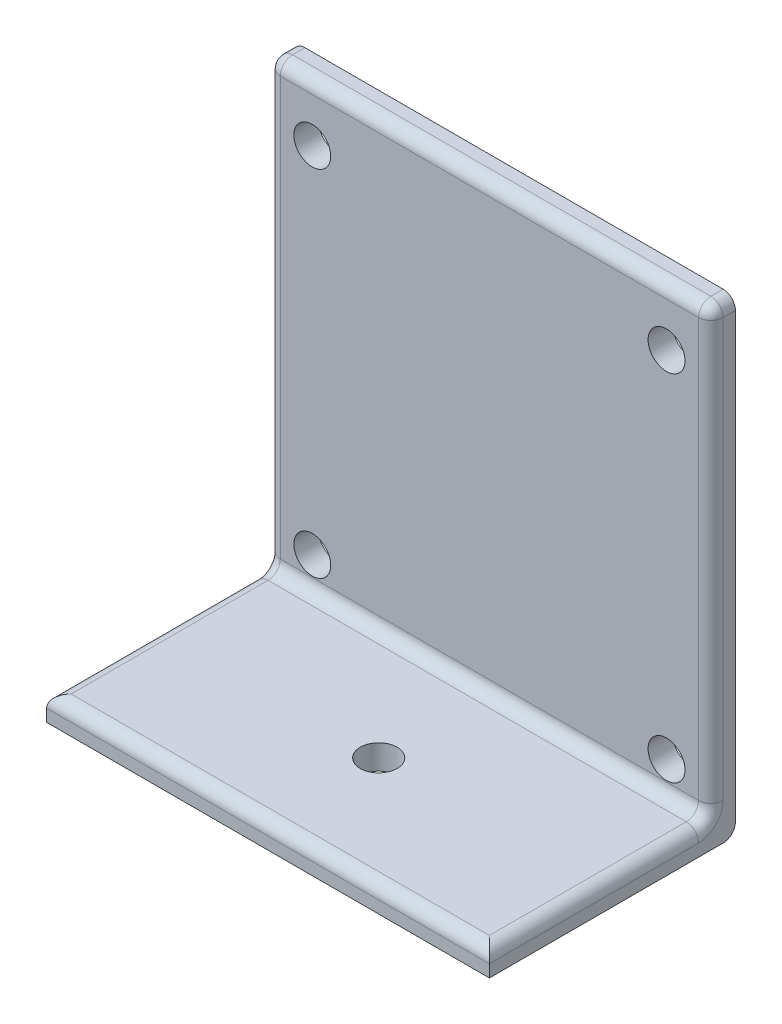
ISO-10303-21;
HEADER;
FILE_DESCRIPTION(('STEP AP214'),'2;1');
FILE_NAME('part.step','',(''),(''),'','','');
FILE_SCHEMA(('AUTOMOTIVE_DESIGN { 1 0 10303 214 1 1 1 1 }'));
ENDSEC;
DATA;
#1=APPLICATION_CONTEXT('core data for automotive mechanical design processes');
#2=APPLICATION_PROTOCOL_DEFINITION('international standard','automotive_design',2000,#1);
#3=PRODUCT_CONTEXT('',#1,'mechanical');
#4=PRODUCT('Part','Part','',(#3));
#5=PRODUCT_RELATED_PRODUCT_CATEGORY('part','',(#4));
#6=PRODUCT_DEFINITION_FORMATION('','',#4);
#7=PRODUCT_DEFINITION_CONTEXT('part definition',#1,'design');
#8=PRODUCT_DEFINITION('design','',#6,#7);
#9=PRODUCT_DEFINITION_SHAPE('','',#8);
#10=(LENGTH_UNIT() NAMED_UNIT(*) SI_UNIT(.MILLI.,.METRE.));
#11=(NAMED_UNIT(*) PLANE_ANGLE_UNIT() SI_UNIT($,.RADIAN.));
#12=(NAMED_UNIT(*) SI_UNIT($,.STERADIAN.) SOLID_ANGLE_UNIT());
#13=UNCERTAINTY_MEASURE_WITH_UNIT(LENGTH_MEASURE(1.E-05),#10,'distance_accuracy_value','');
#14=(GEOMETRIC_REPRESENTATION_CONTEXT(3) GLOBAL_UNCERTAINTY_ASSIGNED_CONTEXT((#13)) GLOBAL_UNIT_ASSIGNED_CONTEXT((#10,
#11,#12)) REPRESENTATION_CONTEXT('',''));
#15=CARTESIAN_POINT('',(0.,0.,0.));
#16=DIRECTION('',(0.,0.,1.));
#17=DIRECTION('',(1.,0.,0.));
#18=AXIS2_PLACEMENT_3D('',#15,#16,#17);
#19=CARTESIAN_POINT('',(0.,2.,0.));
#20=DIRECTION('',(0.,-1.,0.));
#21=DIRECTION('',(0.,0.,-1.));
#22=AXIS2_PLACEMENT_3D('',#19,#20,#21);
#23=PLANE('',#22);
#24=DIRECTION('',(0.,0.,1.));
#25=VECTOR('',#24,1.);
#26=CARTESIAN_POINT('',(-17.,2.,0.));
#27=LINE('',#26,#25);
#28=CARTESIAN_POINT('',(-17.,2.,-7.));
#29=VERTEX_POINT('',#28);
#30=CARTESIAN_POINT('',(-17.,2.,9.));
#31=VERTEX_POINT('',#30);
#32=EDGE_CURVE('E173',#29,#31,#27,.T.);
#33=ORIENTED_EDGE('',*,*,#32,.T.);
#34=DIRECTION('',(1.,0.,0.));
#35=VECTOR('',#34,1.);
#36=CARTESIAN_POINT('',(0.,2.,9.));
#37=LINE('',#36,#35);
#38=CARTESIAN_POINT('',(17.,2.,9.));
#39=VERTEX_POINT('',#38);
#40=EDGE_CURVE('E176',#31,#39,#37,.T.);
#41=ORIENTED_EDGE('',*,*,#40,.T.);
#42=DIRECTION('',(0.,0.,-1.));
#43=VECTOR('',#42,1.);
#44=CARTESIAN_POINT('',(17.,2.,0.));
#45=LINE('',#44,#43);
#46=CARTESIAN_POINT('',(17.,2.,-7.));
#47=VERTEX_POINT('',#46);
#48=EDGE_CURVE('E171',#39,#47,#45,.T.);
#49=ORIENTED_EDGE('',*,*,#48,.T.);
#50=DIRECTION('',(1.,0.,0.));
#51=VECTOR('',#50,1.);
#52=CARTESIAN_POINT('',(-18.,2.,-7.));
#53=LINE('',#52,#51);
#54=EDGE_CURVE('E169',#47,#29,#53,.F.);
#55=ORIENTED_EDGE('',*,*,#54,.T.);
#56=EDGE_LOOP('',(#33,#41,#49,#55));
#57=FACE_BOUND('',#56,.T.);
#58=CARTESIAN_POINT('',(0.,2.,0.999999999999999));
#59=DIRECTION('',(0.,1.,0.));
#60=DIRECTION('',(0.,0.,1.));
#61=AXIS2_PLACEMENT_3D('',#58,#59,#60);
#62=CIRCLE('',#61,1.5);
#63=CARTESIAN_POINT('',(0.,2.,2.5));
#64=VERTEX_POINT('',#63);
#65=EDGE_CURVE('E262',#64,#64,#62,.T.);
#66=ORIENTED_EDGE('',*,*,#65,.F.);
#67=EDGE_LOOP('',(#66));
#68=FACE_BOUND('',#67,.T.);
#69=ADVANCED_FACE('F34',(#57,#68),#23,.F.);
#70=CARTESIAN_POINT('',(18.,2.,10.));
#71=DIRECTION('',(-1.,0.,0.));
#72=DIRECTION('',(0.,0.,1.));
#73=AXIS2_PLACEMENT_3D('',#70,#71,#72);
#74=PLANE('',#73);
#75=DIRECTION('',(0.,0.,-1.));
#76=VECTOR('',#75,1.);
#77=CARTESIAN_POINT('',(18.,0.,10.));
#78=LINE('',#77,#76);
#79=CARTESIAN_POINT('',(18.,0.,10.));
#80=VERTEX_POINT('',#79);
#81=CARTESIAN_POINT('',(18.,0.,-9.));
#82=VERTEX_POINT('',#81);
#83=EDGE_CURVE('E157',#80,#82,#78,.T.);
#84=ORIENTED_EDGE('',*,*,#83,.T.);
#85=CARTESIAN_POINT('',(18.,1.,-9.));
#86=DIRECTION('',(-1.,0.,0.));
#87=DIRECTION('',(0.,0.,1.));
#88=AXIS2_PLACEMENT_3D('',#85,#86,#87);
#89=CIRCLE('',#88,1.);
#90=CARTESIAN_POINT('',(18.,1.,-10.));
#91=VERTEX_POINT('',#90);
#92=EDGE_CURVE('E197',#82,#91,#89,.F.);
#93=ORIENTED_EDGE('',*,*,#92,.T.);
#94=DIRECTION('',(0.,-1.,0.));
#95=VECTOR('',#94,1.);
#96=CARTESIAN_POINT('',(18.,2.,-10.));
#97=LINE('',#96,#95);
#98=CARTESIAN_POINT('',(18.,37.,-10.));
#99=VERTEX_POINT('',#98);
#100=EDGE_CURVE('E166',#99,#91,#97,.T.);
#101=ORIENTED_EDGE('',*,*,#100,.F.);
#102=DIRECTION('',(0.,0.,-1.));
#103=VECTOR('',#102,1.);
#104=CARTESIAN_POINT('',(18.,37.,-8.));
#105=LINE('',#104,#103);
#106=CARTESIAN_POINT('',(18.,37.,-9.));
#107=VERTEX_POINT('',#106);
#108=EDGE_CURVE('E188',#99,#107,#105,.F.);
#109=ORIENTED_EDGE('',*,*,#108,.T.);
#110=DIRECTION('',(0.,-1.,0.));
#111=VECTOR('',#110,1.);
#112=CARTESIAN_POINT('',(18.,2.,-9.));
#113=LINE('',#112,#111);
#114=CARTESIAN_POINT('',(18.,3.,-9.));
#115=VERTEX_POINT('',#114);
#116=EDGE_CURVE('E190',#107,#115,#113,.T.);
#117=ORIENTED_EDGE('',*,*,#116,.T.);
#118=CARTESIAN_POINT('',(18.,3.,-7.));
#119=DIRECTION('',(-1.,0.,0.));
#120=DIRECTION('',(0.,0.,1.));
#121=AXIS2_PLACEMENT_3D('',#118,#119,#120);
#122=CIRCLE('',#121,2.);
#123=CARTESIAN_POINT('',(18.,1.,-7.));
#124=VERTEX_POINT('',#123);
#125=EDGE_CURVE('E192',#124,#115,#122,.F.);
#126=ORIENTED_EDGE('',*,*,#125,.F.);
#127=DIRECTION('',(0.,0.,-1.));
#128=VECTOR('',#127,1.);
#129=CARTESIAN_POINT('',(18.,1.,10.));
#130=LINE('',#129,#128);
#131=CARTESIAN_POINT('',(18.,1.,10.));
#132=VERTEX_POINT('',#131);
#133=EDGE_CURVE('E195',#124,#132,#130,.F.);
#134=ORIENTED_EDGE('',*,*,#133,.T.);
#135=DIRECTION('',(0.,-1.,0.));
#136=VECTOR('',#135,1.);
#137=CARTESIAN_POINT('',(18.,2.,10.));
#138=LINE('',#137,#136);
#139=EDGE_CURVE('E148',#132,#80,#138,.T.);
#140=ORIENTED_EDGE('',*,*,#139,.T.);
#141=EDGE_LOOP('',(#84,#93,#101,#109,#117,#126,#134,#140));
#142=FACE_BOUND('',#141,.T.);
#143=ADVANCED_FACE('F296',(#142),#74,.F.);
#144=CARTESIAN_POINT('',(-18.,2.,-10.));
#145=DIRECTION('',(0.,0.,1.));
#146=DIRECTION('',(1.,0.,0.));
#147=AXIS2_PLACEMENT_3D('',#144,#145,#146);
#148=PLANE('',#147);
#149=CARTESIAN_POINT('',(14.4,4.59999999999999,-10.));
#150=DIRECTION('',(0.,0.,-1.));
#151=DIRECTION('',(-1.,0.,0.));
#152=AXIS2_PLACEMENT_3D('',#149,#150,#151);
#153=CIRCLE('',#152,1.5);
#154=CARTESIAN_POINT('',(12.9,4.59999999999999,-10.));
#155=VERTEX_POINT('',#154);
#156=EDGE_CURVE('E267',#155,#155,#153,.T.);
#157=ORIENTED_EDGE('',*,*,#156,.F.);
#158=EDGE_LOOP('',(#157));
#159=FACE_BOUND('',#158,.T.);
#160=CARTESIAN_POINT('',(-14.4,4.59999999999999,-10.));
#161=DIRECTION('',(0.,0.,-1.));
#162=DIRECTION('',(-1.,0.,0.));
#163=AXIS2_PLACEMENT_3D('',#160,#161,#162);
#164=CIRCLE('',#163,1.5);
#165=CARTESIAN_POINT('',(-15.9,4.59999999999999,-10.));
#166=VERTEX_POINT('',#165);
#167=EDGE_CURVE('E278',#166,#166,#164,.T.);
#168=ORIENTED_EDGE('',*,*,#167,.F.);
#169=EDGE_LOOP('',(#168));
#170=FACE_BOUND('',#169,.T.);
#171=CARTESIAN_POINT('',(-14.4,33.4,-10.));
#172=DIRECTION('',(0.,0.,-1.));
#173=DIRECTION('',(-1.,0.,0.));
#174=AXIS2_PLACEMENT_3D('',#171,#172,#173);
#175=CIRCLE('',#174,1.5);
#176=CARTESIAN_POINT('',(-15.9,33.4,-10.));
#177=VERTEX_POINT('',#176);
#178=EDGE_CURVE('E270',#177,#177,#175,.T.);
#179=ORIENTED_EDGE('',*,*,#178,.F.);
#180=EDGE_LOOP('',(#179));
#181=FACE_BOUND('',#180,.T.);
#182=CARTESIAN_POINT('',(14.4,33.4,-10.));
#183=DIRECTION('',(0.,0.,-1.));
#184=DIRECTION('',(-1.,0.,0.));
#185=AXIS2_PLACEMENT_3D('',#182,#183,#184);
#186=CIRCLE('',#185,1.5);
#187=CARTESIAN_POINT('',(12.9,33.4,-10.));
#188=VERTEX_POINT('',#187);
#189=EDGE_CURVE('E277',#188,#188,#186,.T.);
#190=ORIENTED_EDGE('',*,*,#189,.F.);
#191=EDGE_LOOP('',(#190));
#192=FACE_BOUND('',#191,.T.);
#193=ORIENTED_EDGE('',*,*,#100,.T.);
#194=DIRECTION('',(-1.,0.,0.));
#195=VECTOR('',#194,1.);
#196=CARTESIAN_POINT('',(-18.,1.,-10.));
#197=LINE('',#196,#195);
#198=CARTESIAN_POINT('',(-18.,1.,-10.));
#199=VERTEX_POINT('',#198);
#200=EDGE_CURVE('E43',#91,#199,#197,.T.);
#201=ORIENTED_EDGE('',*,*,#200,.T.);
#202=DIRECTION('',(0.,-1.,0.));
#203=VECTOR('',#202,1.);
#204=CARTESIAN_POINT('',(-18.,2.,-10.));
#205=LINE('',#204,#203);
#206=CARTESIAN_POINT('',(-18.,37.,-10.));
#207=VERTEX_POINT('',#206);
#208=EDGE_CURVE('E147',#207,#199,#205,.T.);
#209=ORIENTED_EDGE('',*,*,#208,.F.);
#210=CARTESIAN_POINT('',(-17.,37.,-10.));
#211=DIRECTION('',(0.,0.,1.));
#212=DIRECTION('',(1.,0.,0.));
#213=AXIS2_PLACEMENT_3D('',#210,#211,#212);
#214=CIRCLE('',#213,1.);
#215=CARTESIAN_POINT('',(-17.,38.,-10.));
#216=VERTEX_POINT('',#215);
#217=EDGE_CURVE('E213',#207,#216,#214,.F.);
#218=ORIENTED_EDGE('',*,*,#217,.T.);
#219=DIRECTION('',(-1.,0.,0.));
#220=VECTOR('',#219,1.);
#221=CARTESIAN_POINT('',(-18.,38.,-10.));
#222=LINE('',#221,#220);
#223=CARTESIAN_POINT('',(17.,38.,-10.));
#224=VERTEX_POINT('',#223);
#225=EDGE_CURVE('E293',#224,#216,#222,.T.);
#226=ORIENTED_EDGE('',*,*,#225,.F.);
#227=CARTESIAN_POINT('',(17.,37.,-10.));
#228=DIRECTION('',(0.,0.,1.));
#229=DIRECTION('',(1.,0.,0.));
#230=AXIS2_PLACEMENT_3D('',#227,#228,#229);
#231=CIRCLE('',#230,1.);
#232=EDGE_CURVE('E215',#224,#99,#231,.F.);
#233=ORIENTED_EDGE('',*,*,#232,.T.);
#234=EDGE_LOOP('',(#193,#201,#209,#218,#226,#233));
#235=FACE_BOUND('',#234,.T.);
#236=ADVANCED_FACE('F302',(#159,#170,#181,#192,#235),#148,.F.);
#237=CARTESIAN_POINT('',(-18.,2.,10.));
#238=DIRECTION('',(1.,0.,0.));
#239=DIRECTION('',(0.,0.,-1.));
#240=AXIS2_PLACEMENT_3D('',#237,#238,#239);
#241=PLANE('',#240);
#242=ORIENTED_EDGE('',*,*,#208,.T.);
#243=CARTESIAN_POINT('',(-18.,1.,-9.));
#244=DIRECTION('',(1.,0.,0.));
#245=DIRECTION('',(0.,0.,-1.));
#246=AXIS2_PLACEMENT_3D('',#243,#244,#245);
#247=CIRCLE('',#246,1.);
#248=CARTESIAN_POINT('',(-18.,0.,-9.));
#249=VERTEX_POINT('',#248);
#250=EDGE_CURVE('E154',#199,#249,#247,.F.);
#251=ORIENTED_EDGE('',*,*,#250,.T.);
#252=DIRECTION('',(0.,0.,1.));
#253=VECTOR('',#252,1.);
#254=CARTESIAN_POINT('',(-18.,0.,10.));
#255=LINE('',#254,#253);
#256=CARTESIAN_POINT('',(-18.,0.,10.));
#257=VERTEX_POINT('',#256);
#258=EDGE_CURVE('E151',#249,#257,#255,.T.);
#259=ORIENTED_EDGE('',*,*,#258,.T.);
#260=DIRECTION('',(0.,-1.,0.));
#261=VECTOR('',#260,1.);
#262=CARTESIAN_POINT('',(-18.,2.,10.));
#263=LINE('',#262,#261);
#264=CARTESIAN_POINT('',(-18.,1.,10.));
#265=VERTEX_POINT('',#264);
#266=EDGE_CURVE('E135',#265,#257,#263,.T.);
#267=ORIENTED_EDGE('',*,*,#266,.F.);
#268=DIRECTION('',(0.,0.,1.));
#269=VECTOR('',#268,1.);
#270=CARTESIAN_POINT('',(-18.,1.,10.));
#271=LINE('',#270,#269);
#272=CARTESIAN_POINT('',(-18.,1.,-7.));
#273=VERTEX_POINT('',#272);
#274=EDGE_CURVE('E185',#265,#273,#271,.F.);
#275=ORIENTED_EDGE('',*,*,#274,.T.);
#276=CARTESIAN_POINT('',(-18.,3.,-7.));
#277=DIRECTION('',(1.,0.,0.));
#278=DIRECTION('',(0.,0.,-1.));
#279=AXIS2_PLACEMENT_3D('',#276,#277,#278);
#280=CIRCLE('',#279,2.);
#281=CARTESIAN_POINT('',(-18.,3.,-9.));
#282=VERTEX_POINT('',#281);
#283=EDGE_CURVE('E182',#282,#273,#280,.F.);
#284=ORIENTED_EDGE('',*,*,#283,.F.);
#285=DIRECTION('',(0.,-1.,0.));
#286=VECTOR('',#285,1.);
#287=CARTESIAN_POINT('',(-18.,2.,-9.));
#288=LINE('',#287,#286);
#289=CARTESIAN_POINT('',(-18.,37.,-9.));
#290=VERTEX_POINT('',#289);
#291=EDGE_CURVE('E180',#282,#290,#288,.F.);
#292=ORIENTED_EDGE('',*,*,#291,.T.);
#293=DIRECTION('',(0.,0.,1.));
#294=VECTOR('',#293,1.);
#295=CARTESIAN_POINT('',(-18.,37.,-10.));
#296=LINE('',#295,#294);
#297=EDGE_CURVE('E178',#290,#207,#296,.F.);
#298=ORIENTED_EDGE('',*,*,#297,.T.);
#299=EDGE_LOOP('',(#242,#251,#259,#267,#275,#284,#292,#298));
#300=FACE_BOUND('',#299,.T.);
#301=ADVANCED_FACE('F153',(#300),#241,.F.);
#302=CARTESIAN_POINT('',(-18.,2.,10.));
#303=DIRECTION('',(0.,0.,-1.));
#304=DIRECTION('',(-1.,0.,0.));
#305=AXIS2_PLACEMENT_3D('',#302,#303,#304);
#306=PLANE('',#305);
#307=ORIENTED_EDGE('',*,*,#139,.F.);
#308=DIRECTION('',(1.,0.,0.));
#309=VECTOR('',#308,1.);
#310=CARTESIAN_POINT('',(-18.,1.,10.));
#311=LINE('',#310,#309);
#312=EDGE_CURVE('E143',#132,#265,#311,.F.);
#313=ORIENTED_EDGE('',*,*,#312,.T.);
#314=ORIENTED_EDGE('',*,*,#266,.T.);
#315=DIRECTION('',(1.,0.,0.));
#316=VECTOR('',#315,1.);
#317=CARTESIAN_POINT('',(-18.,0.,10.));
#318=LINE('',#317,#316);
#319=EDGE_CURVE('E140',#257,#80,#318,.T.);
#320=ORIENTED_EDGE('',*,*,#319,.T.);
#321=EDGE_LOOP('',(#307,#313,#314,#320));
#322=FACE_BOUND('',#321,.T.);
#323=ADVANCED_FACE('F138',(#322),#306,.F.);
#324=CARTESIAN_POINT('',(0.,0.,0.));
#325=DIRECTION('',(0.,-1.,0.));
#326=DIRECTION('',(0.,0.,-1.));
#327=AXIS2_PLACEMENT_3D('',#324,#325,#326);
#328=PLANE('',#327);
#329=CARTESIAN_POINT('',(0.,0.,0.999999999999999));
#330=DIRECTION('',(0.,-1.,0.));
#331=DIRECTION('',(0.,0.,-1.));
#332=AXIS2_PLACEMENT_3D('',#329,#330,#331);
#333=CIRCLE('',#332,1.5);
#334=CARTESIAN_POINT('',(0.,0.,-0.500000000000001));
#335=VERTEX_POINT('',#334);
#336=EDGE_CURVE('E257',#335,#335,#333,.F.);
#337=ORIENTED_EDGE('',*,*,#336,.T.);
#338=EDGE_LOOP('',(#337));
#339=FACE_BOUND('',#338,.T.);
#340=ORIENTED_EDGE('',*,*,#258,.F.);
#341=DIRECTION('',(-1.,0.,0.));
#342=VECTOR('',#341,1.);
#343=CARTESIAN_POINT('',(18.,0.,-9.));
#344=LINE('',#343,#342);
#345=EDGE_CURVE('E11',#249,#82,#344,.F.);
#346=ORIENTED_EDGE('',*,*,#345,.T.);
#347=ORIENTED_EDGE('',*,*,#83,.F.);
#348=ORIENTED_EDGE('',*,*,#319,.F.);
#349=EDGE_LOOP('',(#340,#346,#347,#348));
#350=FACE_BOUND('',#349,.T.);
#351=ADVANCED_FACE('F159',(#339,#350),#328,.T.);
#352=CARTESIAN_POINT('',(-18.,38.,-8.));
#353=DIRECTION('',(0.,0.,-1.));
#354=DIRECTION('',(-1.,0.,0.));
#355=AXIS2_PLACEMENT_3D('',#352,#353,#354);
#356=PLANE('',#355);
#357=DIRECTION('',(0.,-1.,0.));
#358=VECTOR('',#357,1.);
#359=CARTESIAN_POINT('',(-17.,38.,-8.));
#360=LINE('',#359,#358);
#361=CARTESIAN_POINT('',(-17.,37.,-8.));
#362=VERTEX_POINT('',#361);
#363=CARTESIAN_POINT('',(-17.,3.,-8.));
#364=VERTEX_POINT('',#363);
#365=EDGE_CURVE('E200',#362,#364,#360,.T.);
#366=ORIENTED_EDGE('',*,*,#365,.T.);
#367=DIRECTION('',(1.,0.,0.));
#368=VECTOR('',#367,1.);
#369=CARTESIAN_POINT('',(18.,3.,-8.));
#370=LINE('',#369,#368);
#371=CARTESIAN_POINT('',(17.,3.,-8.));
#372=VERTEX_POINT('',#371);
#373=EDGE_CURVE('E206',#364,#372,#370,.T.);
#374=ORIENTED_EDGE('',*,*,#373,.T.);
#375=DIRECTION('',(0.,-1.,0.));
#376=VECTOR('',#375,1.);
#377=CARTESIAN_POINT('',(17.,38.,-8.));
#378=LINE('',#377,#376);
#379=CARTESIAN_POINT('',(17.,37.,-8.));
#380=VERTEX_POINT('',#379);
#381=EDGE_CURVE('E204',#372,#380,#378,.F.);
#382=ORIENTED_EDGE('',*,*,#381,.T.);
#383=DIRECTION('',(1.,0.,0.));
#384=VECTOR('',#383,1.);
#385=CARTESIAN_POINT('',(-18.,37.,-8.));
#386=LINE('',#385,#384);
#387=EDGE_CURVE('E202',#380,#362,#386,.F.);
#388=ORIENTED_EDGE('',*,*,#387,.T.);
#389=EDGE_LOOP('',(#366,#374,#382,#388));
#390=FACE_BOUND('',#389,.T.);
#391=CARTESIAN_POINT('',(14.4,4.59999999999999,-8.));
#392=DIRECTION('',(0.,0.,-1.));
#393=DIRECTION('',(-1.,0.,0.));
#394=AXIS2_PLACEMENT_3D('',#391,#392,#393);
#395=CIRCLE('',#394,1.5);
#396=CARTESIAN_POINT('',(12.9,4.59999999999999,-8.));
#397=VERTEX_POINT('',#396);
#398=EDGE_CURVE('E281',#397,#397,#395,.F.);
#399=ORIENTED_EDGE('',*,*,#398,.F.);
#400=EDGE_LOOP('',(#399));
#401=FACE_BOUND('',#400,.T.);
#402=CARTESIAN_POINT('',(-14.4,4.59999999999999,-8.));
#403=DIRECTION('',(0.,0.,-1.));
#404=DIRECTION('',(-1.,0.,0.));
#405=AXIS2_PLACEMENT_3D('',#402,#403,#404);
#406=CIRCLE('',#405,1.5);
#407=CARTESIAN_POINT('',(-15.9,4.59999999999999,-8.));
#408=VERTEX_POINT('',#407);
#409=EDGE_CURVE('E274',#408,#408,#406,.F.);
#410=ORIENTED_EDGE('',*,*,#409,.F.);
#411=EDGE_LOOP('',(#410));
#412=FACE_BOUND('',#411,.T.);
#413=CARTESIAN_POINT('',(-14.4,33.4,-8.));
#414=DIRECTION('',(0.,0.,-1.));
#415=DIRECTION('',(-1.,0.,0.));
#416=AXIS2_PLACEMENT_3D('',#413,#414,#415);
#417=CIRCLE('',#416,1.5);
#418=CARTESIAN_POINT('',(-15.9,33.4,-8.));
#419=VERTEX_POINT('',#418);
#420=EDGE_CURVE('E273',#419,#419,#417,.F.);
#421=ORIENTED_EDGE('',*,*,#420,.F.);
#422=EDGE_LOOP('',(#421));
#423=FACE_BOUND('',#422,.T.);
#424=CARTESIAN_POINT('',(14.4,33.4,-8.));
#425=DIRECTION('',(0.,0.,-1.));
#426=DIRECTION('',(-1.,0.,0.));
#427=AXIS2_PLACEMENT_3D('',#424,#425,#426);
#428=CIRCLE('',#427,1.5);
#429=CARTESIAN_POINT('',(12.9,33.4,-8.));
#430=VERTEX_POINT('',#429);
#431=EDGE_CURVE('E290',#430,#430,#428,.F.);
#432=ORIENTED_EDGE('',*,*,#431,.F.);
#433=EDGE_LOOP('',(#432));
#434=FACE_BOUND('',#433,.T.);
#435=ADVANCED_FACE('F319',(#390,#401,#412,#423,#434),#356,.F.);
#436=CARTESIAN_POINT('',(0.,38.,0.));
#437=DIRECTION('',(0.,1.,0.));
#438=DIRECTION('',(0.,0.,1.));
#439=AXIS2_PLACEMENT_3D('',#436,#437,#438);
#440=PLANE('',#439);
#441=DIRECTION('',(1.,0.,0.));
#442=VECTOR('',#441,1.);
#443=CARTESIAN_POINT('',(18.,38.,-9.));
#444=LINE('',#443,#442);
#445=CARTESIAN_POINT('',(-17.,38.,-9.));
#446=VERTEX_POINT('',#445);
#447=CARTESIAN_POINT('',(17.,38.,-9.));
#448=VERTEX_POINT('',#447);
#449=EDGE_CURVE('E51',#446,#448,#444,.T.);
#450=ORIENTED_EDGE('',*,*,#449,.T.);
#451=DIRECTION('',(0.,0.,-1.));
#452=VECTOR('',#451,1.);
#453=CARTESIAN_POINT('',(17.,38.,-10.));
#454=LINE('',#453,#452);
#455=EDGE_CURVE('E211',#448,#224,#454,.T.);
#456=ORIENTED_EDGE('',*,*,#455,.T.);
#457=ORIENTED_EDGE('',*,*,#225,.T.);
#458=DIRECTION('',(0.,0.,1.));
#459=VECTOR('',#458,1.);
#460=CARTESIAN_POINT('',(-17.,38.,-8.));
#461=LINE('',#460,#459);
#462=EDGE_CURVE('E56',#216,#446,#461,.T.);
#463=ORIENTED_EDGE('',*,*,#462,.T.);
#464=EDGE_LOOP('',(#450,#456,#457,#463));
#465=FACE_BOUND('',#464,.T.);
#466=ADVANCED_FACE('F521',(#465),#440,.T.);
#467=CARTESIAN_POINT('',(14.4,33.4,10.001));
#468=DIRECTION('',(0.,0.,-1.));
#469=DIRECTION('',(-1.,0.,0.));
#470=AXIS2_PLACEMENT_3D('',#467,#468,#469);
#471=CYLINDRICAL_SURFACE('',#470,1.5);
#472=ORIENTED_EDGE('',*,*,#189,.T.);
#473=EDGE_LOOP('',(#472));
#474=FACE_BOUND('',#473,.T.);
#475=ORIENTED_EDGE('',*,*,#431,.T.);
#476=EDGE_LOOP('',(#475));
#477=FACE_BOUND('',#476,.T.);
#478=ADVANCED_FACE('F512',(#474,#477),#471,.F.);
#479=CARTESIAN_POINT('',(-14.4,33.4,10.001));
#480=DIRECTION('',(0.,0.,-1.));
#481=DIRECTION('',(-1.,0.,0.));
#482=AXIS2_PLACEMENT_3D('',#479,#480,#481);
#483=CYLINDRICAL_SURFACE('',#482,1.5);
#484=ORIENTED_EDGE('',*,*,#178,.T.);
#485=EDGE_LOOP('',(#484));
#486=FACE_BOUND('',#485,.T.);
#487=ORIENTED_EDGE('',*,*,#420,.T.);
#488=EDGE_LOOP('',(#487));
#489=FACE_BOUND('',#488,.T.);
#490=ADVANCED_FACE('F503',(#486,#489),#483,.F.);
#491=CARTESIAN_POINT('',(-14.4,4.59999999999999,10.001));
#492=DIRECTION('',(0.,0.,-1.));
#493=DIRECTION('',(-1.,0.,0.));
#494=AXIS2_PLACEMENT_3D('',#491,#492,#493);
#495=CYLINDRICAL_SURFACE('',#494,1.5);
#496=ORIENTED_EDGE('',*,*,#167,.T.);
#497=EDGE_LOOP('',(#496));
#498=FACE_BOUND('',#497,.T.);
#499=ORIENTED_EDGE('',*,*,#409,.T.);
#500=EDGE_LOOP('',(#499));
#501=FACE_BOUND('',#500,.T.);
#502=ADVANCED_FACE('F494',(#498,#501),#495,.F.);
#503=CARTESIAN_POINT('',(14.4,4.59999999999999,10.001));
#504=DIRECTION('',(0.,0.,-1.));
#505=DIRECTION('',(-1.,0.,0.));
#506=AXIS2_PLACEMENT_3D('',#503,#504,#505);
#507=CYLINDRICAL_SURFACE('',#506,1.5);
#508=ORIENTED_EDGE('',*,*,#156,.T.);
#509=EDGE_LOOP('',(#508));
#510=FACE_BOUND('',#509,.T.);
#511=ORIENTED_EDGE('',*,*,#398,.T.);
#512=EDGE_LOOP('',(#511));
#513=FACE_BOUND('',#512,.T.);
#514=ADVANCED_FACE('F485',(#510,#513),#507,.F.);
#515=CARTESIAN_POINT('',(0.,-0.00100000000000013,0.999999999999999));
#516=DIRECTION('',(0.,1.,0.));
#517=DIRECTION('',(0.,0.,1.));
#518=AXIS2_PLACEMENT_3D('',#515,#516,#517);
#519=CYLINDRICAL_SURFACE('',#518,1.5);
#520=ORIENTED_EDGE('',*,*,#336,.F.);
#521=EDGE_LOOP('',(#520));
#522=FACE_BOUND('',#521,.T.);
#523=ORIENTED_EDGE('',*,*,#65,.T.);
#524=EDGE_LOOP('',(#523));
#525=FACE_BOUND('',#524,.T.);
#526=ADVANCED_FACE('F476',(#522,#525),#519,.F.);
#527=CARTESIAN_POINT('',(17.,37.,0.));
#528=DIRECTION('',(0.,0.,1.));
#529=DIRECTION('',(1.,0.,0.));
#530=AXIS2_PLACEMENT_3D('',#527,#528,#529);
#531=CYLINDRICAL_SURFACE('',#530,1.);
#532=CARTESIAN_POINT('',(17.,37.,-9.));
#533=DIRECTION('',(0.,0.,1.));
#534=DIRECTION('',(0.,-1.,0.));
#535=AXIS2_PLACEMENT_3D('',#532,#533,#534);
#536=CIRCLE('',#535,1.);
#537=EDGE_CURVE('E38',#107,#448,#536,.T.);
#538=ORIENTED_EDGE('',*,*,#537,.F.);
#539=ORIENTED_EDGE('',*,*,#108,.F.);
#540=ORIENTED_EDGE('',*,*,#232,.F.);
#541=ORIENTED_EDGE('',*,*,#455,.F.);
#542=EDGE_LOOP('',(#538,#539,#540,#541));
#543=FACE_BOUND('',#542,.T.);
#544=ADVANCED_FACE('F468',(#543),#531,.T.);
#545=CARTESIAN_POINT('',(17.,37.,-9.));
#546=DIRECTION('',(0.,0.,1.));
#547=DIRECTION('',(1.,0.,0.));
#548=AXIS2_PLACEMENT_3D('',#545,#546,#547);
#549=SPHERICAL_SURFACE('',#548,1.);
#550=CARTESIAN_POINT('',(17.,37.,-9.));
#551=DIRECTION('',(0.,1.,0.));
#552=DIRECTION('',(0.,0.,1.));
#553=AXIS2_PLACEMENT_3D('',#550,#551,#552);
#554=CIRCLE('',#553,1.);
#555=EDGE_CURVE('E249',#107,#380,#554,.F.);
#556=ORIENTED_EDGE('',*,*,#555,.F.);
#557=ORIENTED_EDGE('',*,*,#537,.T.);
#558=CARTESIAN_POINT('',(17.,37.,-9.));
#559=DIRECTION('',(1.,0.,0.));
#560=DIRECTION('',(0.,0.,-1.));
#561=AXIS2_PLACEMENT_3D('',#558,#559,#560);
#562=CIRCLE('',#561,1.);
#563=EDGE_CURVE('E251',#380,#448,#562,.F.);
#564=ORIENTED_EDGE('',*,*,#563,.F.);
#565=EDGE_LOOP('',(#556,#557,#564));
#566=FACE_BOUND('',#565,.T.);
#567=ADVANCED_FACE('F335',(#566),#549,.T.);
#568=CARTESIAN_POINT('',(-17.,37.,0.));
#569=DIRECTION('',(0.,0.,-1.));
#570=DIRECTION('',(-1.,0.,0.));
#571=AXIS2_PLACEMENT_3D('',#568,#569,#570);
#572=CYLINDRICAL_SURFACE('',#571,1.);
#573=ORIENTED_EDGE('',*,*,#217,.F.);
#574=ORIENTED_EDGE('',*,*,#297,.F.);
#575=CARTESIAN_POINT('',(-17.,37.,-9.));
#576=DIRECTION('',(0.,0.,1.));
#577=DIRECTION('',(1.,0.,0.));
#578=AXIS2_PLACEMENT_3D('',#575,#576,#577);
#579=CIRCLE('',#578,1.);
#580=EDGE_CURVE('E246',#446,#290,#579,.T.);
#581=ORIENTED_EDGE('',*,*,#580,.F.);
#582=ORIENTED_EDGE('',*,*,#462,.F.);
#583=EDGE_LOOP('',(#573,#574,#581,#582));
#584=FACE_BOUND('',#583,.T.);
#585=ADVANCED_FACE('F308',(#584),#572,.T.);
#586=CARTESIAN_POINT('',(0.,37.,-9.));
#587=DIRECTION('',(-1.,0.,0.));
#588=DIRECTION('',(0.,0.,1.));
#589=AXIS2_PLACEMENT_3D('',#586,#587,#588);
#590=CYLINDRICAL_SURFACE('',#589,1.);
#591=ORIENTED_EDGE('',*,*,#563,.T.);
#592=ORIENTED_EDGE('',*,*,#449,.F.);
#593=CARTESIAN_POINT('',(-17.,37.,-9.));
#594=DIRECTION('',(-1.,0.,0.));
#595=DIRECTION('',(0.,0.,1.));
#596=AXIS2_PLACEMENT_3D('',#593,#594,#595);
#597=CIRCLE('',#596,1.);
#598=EDGE_CURVE('E243',#362,#446,#597,.T.);
#599=ORIENTED_EDGE('',*,*,#598,.F.);
#600=ORIENTED_EDGE('',*,*,#387,.F.);
#601=EDGE_LOOP('',(#591,#592,#599,#600));
#602=FACE_BOUND('',#601,.T.);
#603=ADVANCED_FACE('F336',(#602),#590,.T.);
#604=CARTESIAN_POINT('',(17.,2.,-9.));
#605=DIRECTION('',(0.,-1.,0.));
#606=DIRECTION('',(0.,0.,-1.));
#607=AXIS2_PLACEMENT_3D('',#604,#605,#606);
#608=CYLINDRICAL_SURFACE('',#607,1.);
#609=ORIENTED_EDGE('',*,*,#555,.T.);
#610=ORIENTED_EDGE('',*,*,#381,.F.);
#611=CARTESIAN_POINT('',(17.,3.,-9.));
#612=DIRECTION('',(0.,-1.,0.));
#613=DIRECTION('',(0.,0.,-1.));
#614=AXIS2_PLACEMENT_3D('',#611,#612,#613);
#615=CIRCLE('',#614,1.);
#616=EDGE_CURVE('E240',#115,#372,#615,.T.);
#617=ORIENTED_EDGE('',*,*,#616,.F.);
#618=ORIENTED_EDGE('',*,*,#116,.F.);
#619=EDGE_LOOP('',(#609,#610,#617,#618));
#620=FACE_BOUND('',#619,.T.);
#621=ADVANCED_FACE('F334',(#620),#608,.T.);
#622=CARTESIAN_POINT('',(-17.,37.,-9.));
#623=DIRECTION('',(0.,0.,1.));
#624=DIRECTION('',(1.,0.,0.));
#625=AXIS2_PLACEMENT_3D('',#622,#623,#624);
#626=SPHERICAL_SURFACE('',#625,1.);
#627=ORIENTED_EDGE('',*,*,#598,.T.);
#628=ORIENTED_EDGE('',*,*,#580,.T.);
#629=CARTESIAN_POINT('',(-17.,37.,-9.));
#630=DIRECTION('',(0.,1.,0.));
#631=DIRECTION('',(0.,0.,1.));
#632=AXIS2_PLACEMENT_3D('',#629,#630,#631);
#633=CIRCLE('',#632,1.);
#634=EDGE_CURVE('E237',#362,#290,#633,.F.);
#635=ORIENTED_EDGE('',*,*,#634,.F.);
#636=EDGE_LOOP('',(#627,#628,#635));
#637=FACE_BOUND('',#636,.T.);
#638=ADVANCED_FACE('F311',(#637),#626,.T.);
#639=CARTESIAN_POINT('',(17.,3.,-7.));
#640=DIRECTION('',(-1.,0.,0.));
#641=DIRECTION('',(0.,0.,1.));
#642=AXIS2_PLACEMENT_3D('',#639,#640,#641);
#643=TOROIDAL_SURFACE('',#642,2.,1.);
#644=ORIENTED_EDGE('',*,*,#125,.T.);
#645=ORIENTED_EDGE('',*,*,#616,.T.);
#646=CARTESIAN_POINT('',(17.,3.,-7.));
#647=DIRECTION('',(-1.,0.,0.));
#648=DIRECTION('',(0.,0.,1.));
#649=AXIS2_PLACEMENT_3D('',#646,#647,#648);
#650=CIRCLE('',#649,1.);
#651=EDGE_CURVE('E235',#47,#372,#650,.F.);
#652=ORIENTED_EDGE('',*,*,#651,.F.);
#653=CARTESIAN_POINT('',(17.,1.,-7.));
#654=DIRECTION('',(0.,0.,-1.));
#655=DIRECTION('',(-1.,0.,0.));
#656=AXIS2_PLACEMENT_3D('',#653,#654,#655);
#657=CIRCLE('',#656,1.);
#658=EDGE_CURVE('E232',#124,#47,#657,.F.);
#659=ORIENTED_EDGE('',*,*,#658,.F.);
#660=EDGE_LOOP('',(#644,#645,#652,#659));
#661=FACE_BOUND('',#660,.T.);
#662=ADVANCED_FACE('F331',(#661),#643,.T.);
#663=CARTESIAN_POINT('',(-17.,38.,-9.));
#664=DIRECTION('',(0.,-1.,0.));
#665=DIRECTION('',(0.,0.,-1.));
#666=AXIS2_PLACEMENT_3D('',#663,#664,#665);
#667=CYLINDRICAL_SURFACE('',#666,1.);
#668=ORIENTED_EDGE('',*,*,#634,.T.);
#669=ORIENTED_EDGE('',*,*,#291,.F.);
#670=CARTESIAN_POINT('',(-17.,3.,-9.));
#671=DIRECTION('',(0.,-1.,0.));
#672=DIRECTION('',(0.,0.,-1.));
#673=AXIS2_PLACEMENT_3D('',#670,#671,#672);
#674=CIRCLE('',#673,1.);
#675=EDGE_CURVE('E229',#364,#282,#674,.T.);
#676=ORIENTED_EDGE('',*,*,#675,.F.);
#677=ORIENTED_EDGE('',*,*,#365,.F.);
#678=EDGE_LOOP('',(#668,#669,#676,#677));
#679=FACE_BOUND('',#678,.T.);
#680=ADVANCED_FACE('F315',(#679),#667,.T.);
#681=CARTESIAN_POINT('',(-18.,3.,-7.));
#682=DIRECTION('',(-1.,0.,0.));
#683=DIRECTION('',(0.,0.,1.));
#684=AXIS2_PLACEMENT_3D('',#681,#682,#683);
#685=CYLINDRICAL_SURFACE('',#684,1.);
#686=ORIENTED_EDGE('',*,*,#651,.T.);
#687=ORIENTED_EDGE('',*,*,#373,.F.);
#688=CARTESIAN_POINT('',(-17.,3.,-7.));
#689=DIRECTION('',(1.,0.,0.));
#690=DIRECTION('',(0.,0.,-1.));
#691=AXIS2_PLACEMENT_3D('',#688,#689,#690);
#692=CIRCLE('',#691,1.);
#693=EDGE_CURVE('E226',#29,#364,#692,.T.);
#694=ORIENTED_EDGE('',*,*,#693,.F.);
#695=ORIENTED_EDGE('',*,*,#54,.F.);
#696=EDGE_LOOP('',(#686,#687,#694,#695));
#697=FACE_BOUND('',#696,.T.);
#698=ADVANCED_FACE('F323',(#697),#685,.F.);
#699=CARTESIAN_POINT('',(17.,1.,0.));
#700=DIRECTION('',(0.,0.,-1.));
#701=DIRECTION('',(-1.,0.,0.));
#702=AXIS2_PLACEMENT_3D('',#699,#700,#701);
#703=CYLINDRICAL_SURFACE('',#702,1.);
#704=ORIENTED_EDGE('',*,*,#658,.T.);
#705=ORIENTED_EDGE('',*,*,#48,.F.);
#706=CARTESIAN_POINT('',(17.,1.,9.));
#707=DIRECTION('',(0.707106781186547,0.,-0.707106781186547));
#708=DIRECTION('',(0.707106781186547,0.,0.707106781186547));
#709=AXIS2_PLACEMENT_3D('',#706,#707,#708);
#710=ELLIPSE('',#709,1.41421356237309,1.);
#711=EDGE_CURVE('E223',#132,#39,#710,.F.);
#712=ORIENTED_EDGE('',*,*,#711,.F.);
#713=ORIENTED_EDGE('',*,*,#133,.F.);
#714=EDGE_LOOP('',(#704,#705,#712,#713));
#715=FACE_BOUND('',#714,.T.);
#716=ADVANCED_FACE('F376',(#715),#703,.T.);
#717=CARTESIAN_POINT('',(-17.,3.,-7.));
#718=DIRECTION('',(1.,0.,0.));
#719=DIRECTION('',(0.,0.,-1.));
#720=AXIS2_PLACEMENT_3D('',#717,#718,#719);
#721=TOROIDAL_SURFACE('',#720,2.,1.);
#722=ORIENTED_EDGE('',*,*,#675,.T.);
#723=ORIENTED_EDGE('',*,*,#283,.T.);
#724=CARTESIAN_POINT('',(-17.,1.,-7.));
#725=DIRECTION('',(0.,0.,-1.));
#726=DIRECTION('',(-1.,0.,0.));
#727=AXIS2_PLACEMENT_3D('',#724,#725,#726);
#728=CIRCLE('',#727,1.);
#729=EDGE_CURVE('E221',#29,#273,#728,.F.);
#730=ORIENTED_EDGE('',*,*,#729,.F.);
#731=ORIENTED_EDGE('',*,*,#693,.T.);
#732=EDGE_LOOP('',(#722,#723,#730,#731));
#733=FACE_BOUND('',#732,.T.);
#734=ADVANCED_FACE('F372',(#733),#721,.T.);
#735=CARTESIAN_POINT('',(0.,1.,9.));
#736=DIRECTION('',(1.,0.,0.));
#737=DIRECTION('',(0.,0.,-1.));
#738=AXIS2_PLACEMENT_3D('',#735,#736,#737);
#739=CYLINDRICAL_SURFACE('',#738,1.);
#740=ORIENTED_EDGE('',*,*,#711,.T.);
#741=ORIENTED_EDGE('',*,*,#40,.F.);
#742=CARTESIAN_POINT('',(-17.,1.,9.));
#743=DIRECTION('',(0.707106781186547,0.,0.707106781186547));
#744=DIRECTION('',(0.707106781186547,0.,-0.707106781186547));
#745=AXIS2_PLACEMENT_3D('',#742,#743,#744);
#746=ELLIPSE('',#745,1.41421356237309,1.);
#747=EDGE_CURVE('E219',#265,#31,#746,.F.);
#748=ORIENTED_EDGE('',*,*,#747,.F.);
#749=ORIENTED_EDGE('',*,*,#312,.F.);
#750=EDGE_LOOP('',(#740,#741,#748,#749));
#751=FACE_BOUND('',#750,.T.);
#752=ADVANCED_FACE('F368',(#751),#739,.T.);
#753=CARTESIAN_POINT('',(-17.,1.,0.));
#754=DIRECTION('',(0.,0.,1.));
#755=DIRECTION('',(1.,0.,0.));
#756=AXIS2_PLACEMENT_3D('',#753,#754,#755);
#757=CYLINDRICAL_SURFACE('',#756,1.);
#758=ORIENTED_EDGE('',*,*,#729,.T.);
#759=ORIENTED_EDGE('',*,*,#274,.F.);
#760=ORIENTED_EDGE('',*,*,#747,.T.);
#761=ORIENTED_EDGE('',*,*,#32,.F.);
#762=EDGE_LOOP('',(#758,#759,#760,#761));
#763=FACE_BOUND('',#762,.T.);
#764=ADVANCED_FACE('F365',(#763),#757,.T.);
#765=CARTESIAN_POINT('',(-18.,1.,-9.));
#766=DIRECTION('',(1.,0.,0.));
#767=DIRECTION('',(0.,0.,-1.));
#768=AXIS2_PLACEMENT_3D('',#765,#766,#767);
#769=CYLINDRICAL_SURFACE('',#768,1.);
#770=ORIENTED_EDGE('',*,*,#92,.F.);
#771=ORIENTED_EDGE('',*,*,#345,.F.);
#772=ORIENTED_EDGE('',*,*,#250,.F.);
#773=ORIENTED_EDGE('',*,*,#200,.F.);
#774=EDGE_LOOP('',(#770,#771,#772,#773));
#775=FACE_BOUND('',#774,.T.);
#776=ADVANCED_FACE('F36',(#775),#769,.T.);
#777=CLOSED_SHELL('',(#69,#143,#236,#301,#323,#351,#435,#466,#478,#490,#502,#514,#526,#544,#567,
#585,#603,#621,#638,#662,#680,#698,#716,#734,#752,#764,#776));
#778=MANIFOLD_SOLID_BREP('B2',#777);
#779=ADVANCED_BREP_SHAPE_REPRESENTATION('',(#18,#778),#14);
#780=SHAPE_DEFINITION_REPRESENTATION(#9,#779);
ENDSEC;
END-ISO-10303-21;
